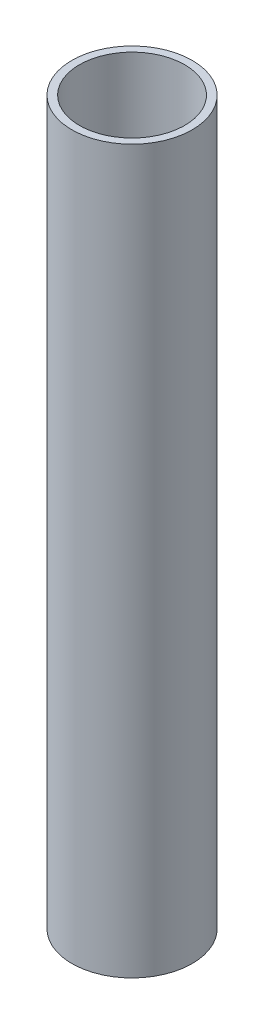
ISO-10303-21;
HEADER;
FILE_DESCRIPTION(('STEP AP214'),'2;1');
FILE_NAME('part.step','',(''),(''),'','','');
FILE_SCHEMA(('AUTOMOTIVE_DESIGN { 1 0 10303 214 1 1 1 1 }'));
ENDSEC;
DATA;
#1=APPLICATION_CONTEXT('core data for automotive mechanical design processes');
#2=APPLICATION_PROTOCOL_DEFINITION('international standard','automotive_design',2000,#1);
#3=PRODUCT_CONTEXT('',#1,'mechanical');
#4=PRODUCT('Part','Part','',(#3));
#5=PRODUCT_RELATED_PRODUCT_CATEGORY('part','',(#4));
#6=PRODUCT_DEFINITION_FORMATION('','',#4);
#7=PRODUCT_DEFINITION_CONTEXT('part definition',#1,'design');
#8=PRODUCT_DEFINITION('design','',#6,#7);
#9=PRODUCT_DEFINITION_SHAPE('','',#8);
#10=(LENGTH_UNIT() NAMED_UNIT(*) SI_UNIT(.MILLI.,.METRE.));
#11=(NAMED_UNIT(*) PLANE_ANGLE_UNIT() SI_UNIT($,.RADIAN.));
#12=(NAMED_UNIT(*) SI_UNIT($,.STERADIAN.) SOLID_ANGLE_UNIT());
#13=UNCERTAINTY_MEASURE_WITH_UNIT(LENGTH_MEASURE(1.E-05),#10,'distance_accuracy_value','');
#14=(GEOMETRIC_REPRESENTATION_CONTEXT(3) GLOBAL_UNCERTAINTY_ASSIGNED_CONTEXT((#13)) GLOBAL_UNIT_ASSIGNED_CONTEXT((#10,
#11,#12)) REPRESENTATION_CONTEXT('',''));
#15=CARTESIAN_POINT('',(0.,0.,0.));
#16=DIRECTION('',(0.,0.,1.));
#17=DIRECTION('',(1.,0.,0.));
#18=AXIS2_PLACEMENT_3D('',#15,#16,#17);
#19=CARTESIAN_POINT('',(0.,304.8,0.));
#20=DIRECTION('',(0.,1.,0.));
#21=DIRECTION('',(0.,0.,1.));
#22=AXIS2_PLACEMENT_3D('',#19,#20,#21);
#23=PLANE('',#22);
#24=CARTESIAN_POINT('',(0.,304.8,0.));
#25=DIRECTION('',(0.,1.,0.));
#26=DIRECTION('',(0.,0.,1.));
#27=AXIS2_PLACEMENT_3D('',#24,#25,#26);
#28=CIRCLE('',#27,25.4);
#29=CARTESIAN_POINT('',(0.,304.8,-25.4));
#30=VERTEX_POINT('',#29);
#31=EDGE_CURVE('E10',#30,#30,#28,.T.);
#32=ORIENTED_EDGE('',*,*,#31,.T.);
#33=EDGE_LOOP('',(#32));
#34=FACE_BOUND('',#33,.T.);
#35=CARTESIAN_POINT('',(0.,304.8,0.));
#36=DIRECTION('',(0.,1.,0.));
#37=DIRECTION('',(0.,0.,1.));
#38=AXIS2_PLACEMENT_3D('',#35,#36,#37);
#39=CIRCLE('',#38,22.225);
#40=CARTESIAN_POINT('',(0.,304.8,-22.225));
#41=VERTEX_POINT('',#40);
#42=EDGE_CURVE('E50',#41,#41,#39,.T.);
#43=ORIENTED_EDGE('',*,*,#42,.F.);
#44=EDGE_LOOP('',(#43));
#45=FACE_BOUND('',#44,.T.);
#46=ADVANCED_FACE('F37',(#34,#45),#23,.T.);
#47=CARTESIAN_POINT('',(0.,0.,0.));
#48=DIRECTION('',(0.,1.,0.));
#49=DIRECTION('',(0.,0.,1.));
#50=AXIS2_PLACEMENT_3D('',#47,#48,#49);
#51=PLANE('',#50);
#52=CARTESIAN_POINT('',(0.,0.,0.));
#53=DIRECTION('',(0.,1.,0.));
#54=DIRECTION('',(0.,0.,1.));
#55=AXIS2_PLACEMENT_3D('',#52,#53,#54);
#56=CIRCLE('',#55,25.4);
#57=CARTESIAN_POINT('',(0.,0.,-25.4));
#58=VERTEX_POINT('',#57);
#59=EDGE_CURVE('E41',#58,#58,#56,.T.);
#60=ORIENTED_EDGE('',*,*,#59,.F.);
#61=EDGE_LOOP('',(#60));
#62=FACE_BOUND('',#61,.T.);
#63=CARTESIAN_POINT('',(0.,0.,0.));
#64=DIRECTION('',(0.,1.,0.));
#65=DIRECTION('',(0.,0.,1.));
#66=AXIS2_PLACEMENT_3D('',#63,#64,#65);
#67=CIRCLE('',#66,22.225);
#68=CARTESIAN_POINT('',(0.,0.,-22.225));
#69=VERTEX_POINT('',#68);
#70=EDGE_CURVE('E52',#69,#69,#67,.T.);
#71=ORIENTED_EDGE('',*,*,#70,.T.);
#72=EDGE_LOOP('',(#71));
#73=FACE_BOUND('',#72,.T.);
#74=ADVANCED_FACE('F64',(#62,#73),#51,.F.);
#75=CARTESIAN_POINT('',(0.,304.8,0.));
#76=DIRECTION('',(0.,-1.,0.));
#77=DIRECTION('',(0.,0.,-1.));
#78=AXIS2_PLACEMENT_3D('',#75,#76,#77);
#79=CYLINDRICAL_SURFACE('',#78,25.4);
#80=CARTESIAN_POINT('',(0.,304.8,-25.4));
#81=CARTESIAN_POINT('',(0.,301.625,-25.4));
#82=CARTESIAN_POINT('',(0.,298.45,-25.4));
#83=CARTESIAN_POINT('',(0.,292.1,-25.4));
#84=CARTESIAN_POINT('',(0.,288.925,-25.4));
#85=CARTESIAN_POINT('',(0.,282.575,-25.4));
#86=CARTESIAN_POINT('',(0.,279.4,-25.4));
#87=CARTESIAN_POINT('',(0.,273.05,-25.4));
#88=CARTESIAN_POINT('',(0.,269.875,-25.4));
#89=CARTESIAN_POINT('',(0.,263.525,-25.4));
#90=CARTESIAN_POINT('',(0.,260.35,-25.4));
#91=CARTESIAN_POINT('',(0.,254.,-25.4));
#92=CARTESIAN_POINT('',(0.,250.825,-25.4));
#93=CARTESIAN_POINT('',(0.,244.475,-25.4));
#94=CARTESIAN_POINT('',(0.,241.3,-25.4));
#95=CARTESIAN_POINT('',(0.,234.95,-25.4));
#96=CARTESIAN_POINT('',(0.,231.775,-25.4));
#97=CARTESIAN_POINT('',(0.,225.425,-25.4));
#98=CARTESIAN_POINT('',(0.,222.25,-25.4));
#99=CARTESIAN_POINT('',(0.,215.9,-25.4));
#100=CARTESIAN_POINT('',(0.,212.725,-25.4));
#101=CARTESIAN_POINT('',(0.,206.375,-25.4));
#102=CARTESIAN_POINT('',(0.,203.2,-25.4));
#103=CARTESIAN_POINT('',(0.,196.85,-25.4));
#104=CARTESIAN_POINT('',(0.,193.675,-25.4));
#105=CARTESIAN_POINT('',(0.,187.325,-25.4));
#106=CARTESIAN_POINT('',(0.,184.15,-25.4));
#107=CARTESIAN_POINT('',(0.,177.8,-25.4));
#108=CARTESIAN_POINT('',(0.,174.625,-25.4));
#109=CARTESIAN_POINT('',(0.,168.275,-25.4));
#110=CARTESIAN_POINT('',(0.,165.1,-25.4));
#111=CARTESIAN_POINT('',(0.,158.75,-25.4));
#112=CARTESIAN_POINT('',(0.,155.575,-25.4));
#113=CARTESIAN_POINT('',(0.,149.225,-25.4));
#114=CARTESIAN_POINT('',(0.,146.05,-25.4));
#115=CARTESIAN_POINT('',(0.,139.7,-25.4));
#116=CARTESIAN_POINT('',(0.,136.525,-25.4));
#117=CARTESIAN_POINT('',(0.,130.175,-25.4));
#118=CARTESIAN_POINT('',(0.,127.,-25.4));
#119=CARTESIAN_POINT('',(0.,120.65,-25.4));
#120=CARTESIAN_POINT('',(0.,117.475,-25.4));
#121=CARTESIAN_POINT('',(0.,111.125,-25.4));
#122=CARTESIAN_POINT('',(0.,107.95,-25.4));
#123=CARTESIAN_POINT('',(0.,101.6,-25.4));
#124=CARTESIAN_POINT('',(0.,98.425,-25.4));
#125=CARTESIAN_POINT('',(0.,92.075,-25.4));
#126=CARTESIAN_POINT('',(0.,88.9,-25.4));
#127=CARTESIAN_POINT('',(0.,82.55,-25.4));
#128=CARTESIAN_POINT('',(0.,79.375,-25.4));
#129=CARTESIAN_POINT('',(0.,73.025,-25.4));
#130=CARTESIAN_POINT('',(0.,69.85,-25.4));
#131=CARTESIAN_POINT('',(0.,63.5,-25.4));
#132=CARTESIAN_POINT('',(0.,60.325,-25.4));
#133=CARTESIAN_POINT('',(0.,53.975,-25.4));
#134=CARTESIAN_POINT('',(0.,50.8,-25.4));
#135=CARTESIAN_POINT('',(0.,44.45,-25.4));
#136=CARTESIAN_POINT('',(0.,41.275,-25.4));
#137=CARTESIAN_POINT('',(0.,34.925,-25.4));
#138=CARTESIAN_POINT('',(0.,31.75,-25.4));
#139=CARTESIAN_POINT('',(0.,25.4,-25.4));
#140=CARTESIAN_POINT('',(0.,22.225,-25.4));
#141=CARTESIAN_POINT('',(0.,15.875,-25.4));
#142=CARTESIAN_POINT('',(0.,12.7,-25.4));
#143=CARTESIAN_POINT('',(0.,6.35,-25.4));
#144=CARTESIAN_POINT('',(0.,3.175,-25.4));
#145=CARTESIAN_POINT('',(0.,0.,-25.4));
#146=B_SPLINE_CURVE_WITH_KNOTS('',3,(#80,#81,#82,#83,#84,#85,#86,#87,#88,#89,#90,#91,#92,#93,
#94,#95,#96,#97,#98,#99,#100,#101,#102,#103,#104,#105,#106,#107,#108,#109,#110,#111,#112,#113,
#114,#115,#116,#117,#118,#119,#120,#121,#122,#123,#124,#125,#126,#127,#128,#129,#130,#131,#132,
#133,#134,#135,#136,#137,#138,#139,#140,#141,#142,#143,#144,#145),.UNSPECIFIED.,.F.,.F.,(4,2,2,
2,2,2,2,2,2,2,2,2,2,2,2,2,2,2,2,2,2,2,2,2,2,2,2,2,2,2,2,2,4),(0.,9.52499999999995,19.05,28.575,
38.1,47.625,57.15,66.675,76.2,85.725,95.2499999999999,104.775,114.3,123.825,133.35,142.875,
152.4,161.925,171.45,180.975,190.5,200.025,209.55,219.075,228.6,238.125,247.65,257.175,266.7,
276.225,285.75,295.275,304.8),.UNSPECIFIED.);
#147=EDGE_CURVE('BSEAM39',#30,#58,#146,.T.);
#148=ORIENTED_EDGE('',*,*,#31,.F.);
#149=ORIENTED_EDGE('',*,*,#59,.T.);
#150=ORIENTED_EDGE('',*,*,#147,.T.);
#151=ORIENTED_EDGE('',*,*,#147,.F.);
#152=EDGE_LOOP('',(#148,#150,#149,#151));
#153=FACE_BOUND('',#152,.T.);
#154=ADVANCED_FACE('F39',(#153),#79,.T.);
#155=CARTESIAN_POINT('',(0.,304.8,0.));
#156=DIRECTION('',(0.,-1.,0.));
#157=DIRECTION('',(0.,0.,-1.));
#158=AXIS2_PLACEMENT_3D('',#155,#156,#157);
#159=CYLINDRICAL_SURFACE('',#158,22.225);
#160=CARTESIAN_POINT('',(0.,304.8,-22.225));
#161=CARTESIAN_POINT('',(0.,301.625,-22.225));
#162=CARTESIAN_POINT('',(0.,298.45,-22.225));
#163=CARTESIAN_POINT('',(0.,292.1,-22.225));
#164=CARTESIAN_POINT('',(0.,288.925,-22.225));
#165=CARTESIAN_POINT('',(0.,282.575,-22.225));
#166=CARTESIAN_POINT('',(0.,279.4,-22.225));
#167=CARTESIAN_POINT('',(0.,273.05,-22.225));
#168=CARTESIAN_POINT('',(0.,269.875,-22.225));
#169=CARTESIAN_POINT('',(0.,263.525,-22.225));
#170=CARTESIAN_POINT('',(0.,260.35,-22.225));
#171=CARTESIAN_POINT('',(0.,254.,-22.225));
#172=CARTESIAN_POINT('',(0.,250.825,-22.225));
#173=CARTESIAN_POINT('',(0.,244.475,-22.225));
#174=CARTESIAN_POINT('',(0.,241.3,-22.225));
#175=CARTESIAN_POINT('',(0.,234.95,-22.225));
#176=CARTESIAN_POINT('',(0.,231.775,-22.225));
#177=CARTESIAN_POINT('',(0.,225.425,-22.225));
#178=CARTESIAN_POINT('',(0.,222.25,-22.225));
#179=CARTESIAN_POINT('',(0.,215.9,-22.225));
#180=CARTESIAN_POINT('',(0.,212.725,-22.225));
#181=CARTESIAN_POINT('',(0.,206.375,-22.225));
#182=CARTESIAN_POINT('',(0.,203.2,-22.225));
#183=CARTESIAN_POINT('',(0.,196.85,-22.225));
#184=CARTESIAN_POINT('',(0.,193.675,-22.225));
#185=CARTESIAN_POINT('',(0.,187.325,-22.225));
#186=CARTESIAN_POINT('',(0.,184.15,-22.225));
#187=CARTESIAN_POINT('',(0.,177.8,-22.225));
#188=CARTESIAN_POINT('',(0.,174.625,-22.225));
#189=CARTESIAN_POINT('',(0.,168.275,-22.225));
#190=CARTESIAN_POINT('',(0.,165.1,-22.225));
#191=CARTESIAN_POINT('',(0.,158.75,-22.225));
#192=CARTESIAN_POINT('',(0.,155.575,-22.225));
#193=CARTESIAN_POINT('',(0.,149.225,-22.225));
#194=CARTESIAN_POINT('',(0.,146.05,-22.225));
#195=CARTESIAN_POINT('',(0.,139.7,-22.225));
#196=CARTESIAN_POINT('',(0.,136.525,-22.225));
#197=CARTESIAN_POINT('',(0.,130.175,-22.225));
#198=CARTESIAN_POINT('',(0.,127.,-22.225));
#199=CARTESIAN_POINT('',(0.,120.65,-22.225));
#200=CARTESIAN_POINT('',(0.,117.475,-22.225));
#201=CARTESIAN_POINT('',(0.,111.125,-22.225));
#202=CARTESIAN_POINT('',(0.,107.95,-22.225));
#203=CARTESIAN_POINT('',(0.,101.6,-22.225));
#204=CARTESIAN_POINT('',(0.,98.425,-22.225));
#205=CARTESIAN_POINT('',(0.,92.075,-22.225));
#206=CARTESIAN_POINT('',(0.,88.9,-22.225));
#207=CARTESIAN_POINT('',(0.,82.55,-22.225));
#208=CARTESIAN_POINT('',(0.,79.375,-22.225));
#209=CARTESIAN_POINT('',(0.,73.025,-22.225));
#210=CARTESIAN_POINT('',(0.,69.85,-22.225));
#211=CARTESIAN_POINT('',(0.,63.5,-22.225));
#212=CARTESIAN_POINT('',(0.,60.325,-22.225));
#213=CARTESIAN_POINT('',(0.,53.975,-22.225));
#214=CARTESIAN_POINT('',(0.,50.8,-22.225));
#215=CARTESIAN_POINT('',(0.,44.45,-22.225));
#216=CARTESIAN_POINT('',(0.,41.275,-22.225));
#217=CARTESIAN_POINT('',(0.,34.925,-22.225));
#218=CARTESIAN_POINT('',(0.,31.75,-22.225));
#219=CARTESIAN_POINT('',(0.,25.4,-22.225));
#220=CARTESIAN_POINT('',(0.,22.225,-22.225));
#221=CARTESIAN_POINT('',(0.,15.875,-22.225));
#222=CARTESIAN_POINT('',(0.,12.7,-22.225));
#223=CARTESIAN_POINT('',(0.,6.35,-22.225));
#224=CARTESIAN_POINT('',(0.,3.175,-22.225));
#225=CARTESIAN_POINT('',(0.,0.,-22.225));
#226=B_SPLINE_CURVE_WITH_KNOTS('',3,(#160,#161,#162,#163,#164,#165,#166,#167,#168,#169,#170,
#171,#172,#173,#174,#175,#176,#177,#178,#179,#180,#181,#182,#183,#184,#185,#186,#187,#188,#189,
#190,#191,#192,#193,#194,#195,#196,#197,#198,#199,#200,#201,#202,#203,#204,#205,#206,#207,#208,
#209,#210,#211,#212,#213,#214,#215,#216,#217,#218,#219,#220,#221,#222,#223,#224,#225),
.UNSPECIFIED.,.F.,.F.,(4,2,2,2,2,2,2,2,2,2,2,2,2,2,2,2,2,2,2,2,2,2,2,2,2,2,2,2,2,2,2,2,4),(0.,
9.52500000000001,19.05,28.575,38.1,47.625,57.15,66.675,76.2,85.7250000000001,95.2500000000001,
104.775,114.3,123.825,133.35,142.875,152.4,161.925,171.45,180.975,190.5,200.025,209.55,219.075,
228.6,238.125,247.65,257.175,266.7,276.225,285.75,295.275,304.8),.UNSPECIFIED.);
#227=EDGE_CURVE('BSEAM60',#41,#69,#226,.T.);
#228=ORIENTED_EDGE('',*,*,#42,.T.);
#229=ORIENTED_EDGE('',*,*,#70,.F.);
#230=ORIENTED_EDGE('',*,*,#227,.T.);
#231=ORIENTED_EDGE('',*,*,#227,.F.);
#232=EDGE_LOOP('',(#228,#230,#229,#231));
#233=FACE_BOUND('',#232,.T.);
#234=ADVANCED_FACE('F60',(#233),#159,.F.);
#235=CLOSED_SHELL('',(#46,#74,#154,#234));
#236=MANIFOLD_SOLID_BREP('B2',#235);
#237=ADVANCED_BREP_SHAPE_REPRESENTATION('',(#18,#236),#14);
#238=SHAPE_DEFINITION_REPRESENTATION(#9,#237);
ENDSEC;
END-ISO-10303-21;
